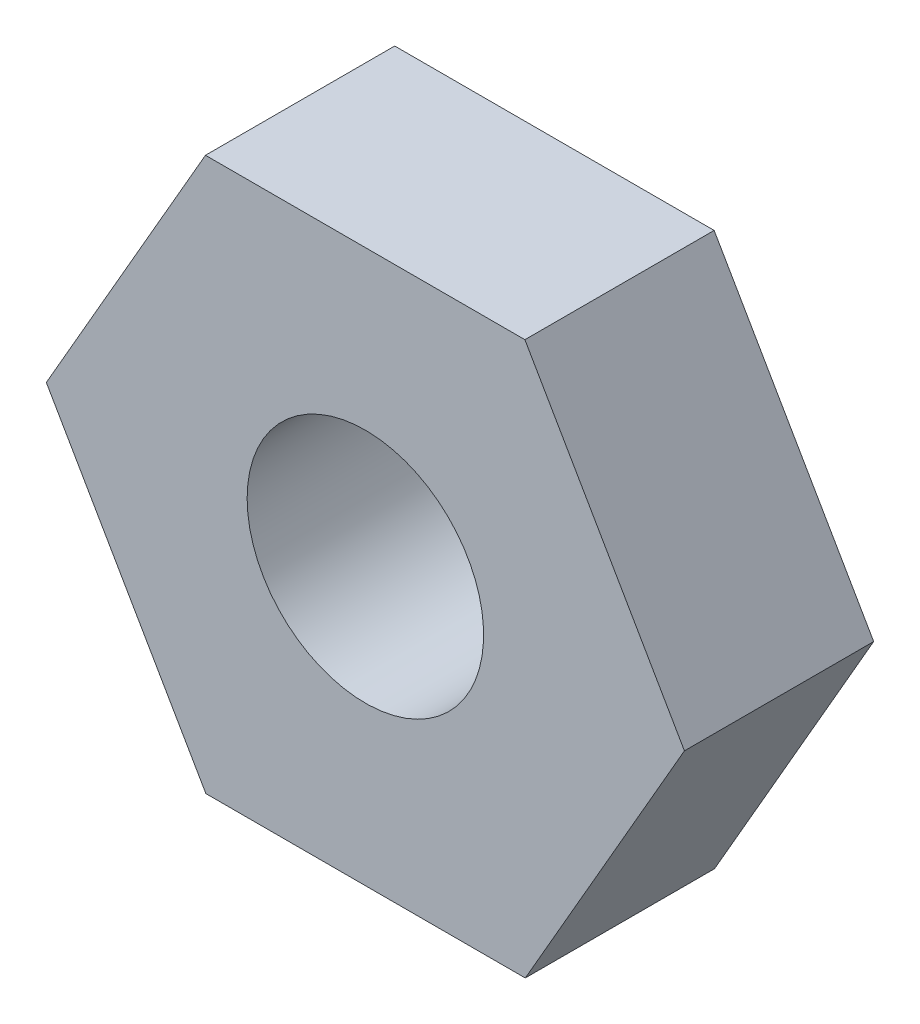
ISO-10303-21;
HEADER;
FILE_DESCRIPTION(('STEP AP214'),'2;1');
FILE_NAME('part.step','',(''),(''),'','','');
FILE_SCHEMA(('AUTOMOTIVE_DESIGN { 1 0 10303 214 1 1 1 1 }'));
ENDSEC;
DATA;
#1=APPLICATION_CONTEXT('core data for automotive mechanical design processes');
#2=APPLICATION_PROTOCOL_DEFINITION('international standard','automotive_design',2000,#1);
#3=PRODUCT_CONTEXT('',#1,'mechanical');
#4=PRODUCT('Part','Part','',(#3));
#5=PRODUCT_RELATED_PRODUCT_CATEGORY('part','',(#4));
#6=PRODUCT_DEFINITION_FORMATION('','',#4);
#7=PRODUCT_DEFINITION_CONTEXT('part definition',#1,'design');
#8=PRODUCT_DEFINITION('design','',#6,#7);
#9=PRODUCT_DEFINITION_SHAPE('','',#8);
#10=(LENGTH_UNIT() NAMED_UNIT(*) SI_UNIT(.MILLI.,.METRE.));
#11=(NAMED_UNIT(*) PLANE_ANGLE_UNIT() SI_UNIT($,.RADIAN.));
#12=(NAMED_UNIT(*) SI_UNIT($,.STERADIAN.) SOLID_ANGLE_UNIT());
#13=UNCERTAINTY_MEASURE_WITH_UNIT(LENGTH_MEASURE(1.E-05),#10,'distance_accuracy_value','');
#14=(GEOMETRIC_REPRESENTATION_CONTEXT(3) GLOBAL_UNCERTAINTY_ASSIGNED_CONTEXT((#13)) GLOBAL_UNIT_ASSIGNED_CONTEXT((#10,
#11,#12)) REPRESENTATION_CONTEXT('',''));
#15=CARTESIAN_POINT('',(0.,0.,0.));
#16=DIRECTION('',(0.,0.,1.));
#17=DIRECTION('',(1.,0.,0.));
#18=AXIS2_PLACEMENT_3D('',#15,#16,#17);
#19=CARTESIAN_POINT('',(-2.67630717283164,-4.63550000000025,3.175));
#20=DIRECTION('',(0.,0.,1.));
#21=DIRECTION('',(1.,0.,0.));
#22=AXIS2_PLACEMENT_3D('',#19,#20,#21);
#23=PLANE('',#22);
#24=DIRECTION('',(1.,0.,0.));
#25=VECTOR('',#24,1.);
#26=CARTESIAN_POINT('',(2.67630717283242,4.6355,3.175));
#27=LINE('',#26,#25);
#28=CARTESIAN_POINT('',(2.67630717283242,4.6355,3.175));
#29=VERTEX_POINT('',#28);
#30=CARTESIAN_POINT('',(-2.68255612418209,4.6355,3.175));
#31=VERTEX_POINT('',#30);
#32=EDGE_CURVE('E106',#29,#31,#27,.F.);
#33=ORIENTED_EDGE('',*,*,#32,.T.);
#34=DIRECTION('',(0.499123639839712,0.86653077969173,0.));
#35=VECTOR('',#34,1.);
#36=CARTESIAN_POINT('',(-2.68255612418209,4.6355,3.175));
#37=LINE('',#36,#35);
#38=CARTESIAN_POINT('',(-5.3526143456565,9.03799468677016E-13,3.175));
#39=VERTEX_POINT('',#38);
#40=EDGE_CURVE('E101',#31,#39,#37,.F.);
#41=ORIENTED_EDGE('',*,*,#40,.T.);
#42=DIRECTION('',(-0.499999999999394,0.866025403784788,0.));
#43=VECTOR('',#42,1.);
#44=CARTESIAN_POINT('',(-5.3526143456565,9.04875133156402E-13,3.175));
#45=LINE('',#44,#43);
#46=CARTESIAN_POINT('',(-2.67630717283164,-4.63550000000025,3.175));
#47=VERTEX_POINT('',#46);
#48=EDGE_CURVE('E70',#39,#47,#45,.F.);
#49=ORIENTED_EDGE('',*,*,#48,.T.);
#50=DIRECTION('',(1.,0.,0.));
#51=VECTOR('',#50,1.);
#52=CARTESIAN_POINT('',(-2.67630717283164,-4.63550000000025,3.175));
#53=LINE('',#52,#51);
#54=CARTESIAN_POINT('',(2.68255612418174,-4.63550000000025,3.175));
#55=VERTEX_POINT('',#54);
#56=EDGE_CURVE('E68',#47,#55,#53,.T.);
#57=ORIENTED_EDGE('',*,*,#56,.T.);
#58=DIRECTION('',(-0.499123639839719,-0.866530779691726,0.));
#59=VECTOR('',#58,1.);
#60=CARTESIAN_POINT('',(5.35261434565674,-2.26381413614973E-13,3.175));
#61=LINE('',#60,#59);
#62=CARTESIAN_POINT('',(5.35261434565674,-2.26381413614973E-13,3.175));
#63=VERTEX_POINT('',#62);
#64=EDGE_CURVE('E65',#55,#63,#61,.F.);
#65=ORIENTED_EDGE('',*,*,#64,.T.);
#66=DIRECTION('',(0.499999999999394,-0.866025403784788,0.));
#67=VECTOR('',#66,1.);
#68=CARTESIAN_POINT('',(5.35261434565674,-2.26381413614973E-13,3.175));
#69=LINE('',#68,#67);
#70=EDGE_CURVE('E111',#63,#29,#69,.F.);
#71=ORIENTED_EDGE('',*,*,#70,.T.);
#72=EDGE_LOOP('',(#33,#41,#49,#57,#65,#71));
#73=FACE_BOUND('',#72,.T.);
#74=CARTESIAN_POINT('',(0.,0.,3.175));
#75=DIRECTION('',(0.,0.,-1.));
#76=DIRECTION('',(-1.,0.,0.));
#77=AXIS2_PLACEMENT_3D('',#74,#75,#76);
#78=CIRCLE('',#77,1.98374);
#79=CARTESIAN_POINT('',(-1.98374,0.,3.175));
#80=VERTEX_POINT('',#79);
#81=EDGE_CURVE('E18',#80,#80,#78,.T.);
#82=ORIENTED_EDGE('',*,*,#81,.T.);
#83=EDGE_LOOP('',(#82));
#84=FACE_BOUND('',#83,.T.);
#85=ADVANCED_FACE('F15',(#73,#84),#23,.T.);
#86=CARTESIAN_POINT('',(0.,0.,-11.3382349024372));
#87=DIRECTION('',(0.,0.,-1.));
#88=DIRECTION('',(-1.,0.,0.));
#89=AXIS2_PLACEMENT_3D('',#86,#87,#88);
#90=CYLINDRICAL_SURFACE('',#89,1.98374);
#91=ORIENTED_EDGE('',*,*,#81,.F.);
#92=EDGE_LOOP('',(#91));
#93=FACE_BOUND('',#92,.T.);
#94=CARTESIAN_POINT('',(0.,0.,0.));
#95=DIRECTION('',(0.,0.,-1.));
#96=DIRECTION('',(-1.,0.,0.));
#97=AXIS2_PLACEMENT_3D('',#94,#95,#96);
#98=CIRCLE('',#97,1.98374);
#99=CARTESIAN_POINT('',(-1.98374,0.,0.));
#100=VERTEX_POINT('',#99);
#101=EDGE_CURVE('E89',#100,#100,#98,.T.);
#102=ORIENTED_EDGE('',*,*,#101,.T.);
#103=EDGE_LOOP('',(#102));
#104=FACE_BOUND('',#103,.T.);
#105=ADVANCED_FACE('F152',(#93,#104),#90,.F.);
#106=CARTESIAN_POINT('',(-2.67630717283164,-4.63550000000025,3.175));
#107=DIRECTION('',(0.,1.,0.));
#108=DIRECTION('',(0.,0.,1.));
#109=AXIS2_PLACEMENT_3D('',#106,#107,#108);
#110=PLANE('',#109);
#111=DIRECTION('',(0.,0.,1.));
#112=VECTOR('',#111,1.);
#113=CARTESIAN_POINT('',(2.68255612418174,-4.63550000000025,3.175));
#114=LINE('',#113,#112);
#115=CARTESIAN_POINT('',(2.68255612418174,-4.63550000000025,0.));
#116=VERTEX_POINT('',#115);
#117=EDGE_CURVE('E75',#116,#55,#114,.T.);
#118=ORIENTED_EDGE('',*,*,#117,.T.);
#119=ORIENTED_EDGE('',*,*,#56,.F.);
#120=DIRECTION('',(0.,0.,1.));
#121=VECTOR('',#120,1.);
#122=CARTESIAN_POINT('',(-2.67630717283164,-4.63550000000025,3.175));
#123=LINE('',#122,#121);
#124=CARTESIAN_POINT('',(-2.67630717283164,-4.63550000000025,0.));
#125=VERTEX_POINT('',#124);
#126=EDGE_CURVE('E91',#47,#125,#123,.F.);
#127=ORIENTED_EDGE('',*,*,#126,.T.);
#128=DIRECTION('',(1.,0.,0.));
#129=VECTOR('',#128,1.);
#130=CARTESIAN_POINT('',(-2.67630717283164,-4.63550000000025,0.));
#131=LINE('',#130,#129);
#132=EDGE_CURVE('E86',#125,#116,#131,.T.);
#133=ORIENTED_EDGE('',*,*,#132,.T.);
#134=EDGE_LOOP('',(#118,#119,#127,#133));
#135=FACE_BOUND('',#134,.T.);
#136=ADVANCED_FACE('F85',(#135),#110,.F.);
#137=CARTESIAN_POINT('',(5.35261434565674,-2.26381413614973E-13,3.175));
#138=DIRECTION('',(-0.866530779691726,0.499123639839719,0.));
#139=DIRECTION('',(-0.499123639839719,-0.866530779691726,0.));
#140=AXIS2_PLACEMENT_3D('',#137,#138,#139);
#141=PLANE('',#140);
#142=DIRECTION('',(0.,0.,1.));
#143=VECTOR('',#142,1.);
#144=CARTESIAN_POINT('',(5.35261434565674,-2.26381413614973E-13,3.175));
#145=LINE('',#144,#143);
#146=CARTESIAN_POINT('',(5.35261434565674,-2.26381413614973E-13,0.));
#147=VERTEX_POINT('',#146);
#148=EDGE_CURVE('E82',#147,#63,#145,.T.);
#149=ORIENTED_EDGE('',*,*,#148,.T.);
#150=ORIENTED_EDGE('',*,*,#64,.F.);
#151=ORIENTED_EDGE('',*,*,#117,.F.);
#152=DIRECTION('',(0.49912363983972,0.866530779691725,0.));
#153=VECTOR('',#152,1.);
#154=CARTESIAN_POINT('',(2.68255612418174,-4.63550000000025,0.));
#155=LINE('',#154,#153);
#156=EDGE_CURVE('E94',#116,#147,#155,.T.);
#157=ORIENTED_EDGE('',*,*,#156,.T.);
#158=EDGE_LOOP('',(#149,#150,#151,#157));
#159=FACE_BOUND('',#158,.T.);
#160=ADVANCED_FACE('F79',(#159),#141,.F.);
#161=CARTESIAN_POINT('',(5.35261434565674,-2.26381413614973E-13,3.175));
#162=DIRECTION('',(-0.866025403784788,-0.499999999999394,0.));
#163=DIRECTION('',(0.499999999999394,-0.866025403784788,0.));
#164=AXIS2_PLACEMENT_3D('',#161,#162,#163);
#165=PLANE('',#164);
#166=DIRECTION('',(0.,0.,-1.));
#167=VECTOR('',#166,1.);
#168=CARTESIAN_POINT('',(2.67630717283242,4.6355,3.175));
#169=LINE('',#168,#167);
#170=CARTESIAN_POINT('',(2.67630717283242,4.6355,0.));
#171=VERTEX_POINT('',#170);
#172=EDGE_CURVE('E108',#171,#29,#169,.F.);
#173=ORIENTED_EDGE('',*,*,#172,.T.);
#174=ORIENTED_EDGE('',*,*,#70,.F.);
#175=ORIENTED_EDGE('',*,*,#148,.F.);
#176=DIRECTION('',(-0.499999999999394,0.866025403784788,0.));
#177=VECTOR('',#176,1.);
#178=CARTESIAN_POINT('',(5.35261434565674,-2.26381413614973E-13,0.));
#179=LINE('',#178,#177);
#180=EDGE_CURVE('E122',#147,#171,#179,.T.);
#181=ORIENTED_EDGE('',*,*,#180,.T.);
#182=EDGE_LOOP('',(#173,#174,#175,#181));
#183=FACE_BOUND('',#182,.T.);
#184=ADVANCED_FACE('F120',(#183),#165,.F.);
#185=CARTESIAN_POINT('',(2.67630717283242,4.6355,3.175));
#186=DIRECTION('',(0.,-1.,0.));
#187=DIRECTION('',(0.,0.,-1.));
#188=AXIS2_PLACEMENT_3D('',#185,#186,#187);
#189=PLANE('',#188);
#190=DIRECTION('',(0.,0.,1.));
#191=VECTOR('',#190,1.);
#192=CARTESIAN_POINT('',(-2.68255612418209,4.6355,3.175));
#193=LINE('',#192,#191);
#194=CARTESIAN_POINT('',(-2.68255612418209,4.6355,0.));
#195=VERTEX_POINT('',#194);
#196=EDGE_CURVE('E103',#195,#31,#193,.T.);
#197=ORIENTED_EDGE('',*,*,#196,.T.);
#198=ORIENTED_EDGE('',*,*,#32,.F.);
#199=ORIENTED_EDGE('',*,*,#172,.F.);
#200=DIRECTION('',(1.,0.,0.));
#201=VECTOR('',#200,1.);
#202=CARTESIAN_POINT('',(-2.67630717283164,4.6355,0.));
#203=LINE('',#202,#201);
#204=EDGE_CURVE('E124',#171,#195,#203,.F.);
#205=ORIENTED_EDGE('',*,*,#204,.T.);
#206=EDGE_LOOP('',(#197,#198,#199,#205));
#207=FACE_BOUND('',#206,.T.);
#208=ADVANCED_FACE('F116',(#207),#189,.F.);
#209=CARTESIAN_POINT('',(-2.68255612418209,4.6355,3.175));
#210=DIRECTION('',(0.86653077969173,-0.499123639839712,0.));
#211=DIRECTION('',(0.499123639839712,0.86653077969173,0.));
#212=AXIS2_PLACEMENT_3D('',#209,#210,#211);
#213=PLANE('',#212);
#214=DIRECTION('',(0.,0.,1.));
#215=VECTOR('',#214,1.);
#216=CARTESIAN_POINT('',(-5.3526143456565,9.03889690784694E-13,3.175));
#217=LINE('',#216,#215);
#218=CARTESIAN_POINT('',(-5.3526143456565,9.03989204057201E-13,0.));
#219=VERTEX_POINT('',#218);
#220=EDGE_CURVE('E32',#219,#39,#217,.T.);
#221=ORIENTED_EDGE('',*,*,#220,.T.);
#222=ORIENTED_EDGE('',*,*,#40,.F.);
#223=ORIENTED_EDGE('',*,*,#196,.F.);
#224=DIRECTION('',(-0.499123639839712,-0.86653077969173,0.));
#225=VECTOR('',#224,1.);
#226=CARTESIAN_POINT('',(-2.68255612418209,4.6355,0.));
#227=LINE('',#226,#225);
#228=EDGE_CURVE('E24',#195,#219,#227,.T.);
#229=ORIENTED_EDGE('',*,*,#228,.T.);
#230=EDGE_LOOP('',(#221,#222,#223,#229));
#231=FACE_BOUND('',#230,.T.);
#232=ADVANCED_FACE('F131',(#231),#213,.F.);
#233=CARTESIAN_POINT('',(-5.3526143456565,9.04875133156402E-13,3.175));
#234=DIRECTION('',(0.866025403784788,0.499999999999394,0.));
#235=DIRECTION('',(-0.499999999999394,0.866025403784788,0.));
#236=AXIS2_PLACEMENT_3D('',#233,#234,#235);
#237=PLANE('',#236);
#238=ORIENTED_EDGE('',*,*,#126,.F.);
#239=ORIENTED_EDGE('',*,*,#48,.F.);
#240=ORIENTED_EDGE('',*,*,#220,.F.);
#241=DIRECTION('',(0.499999999999395,-0.866025403784788,0.));
#242=VECTOR('',#241,1.);
#243=CARTESIAN_POINT('',(-5.3526143456565,9.03790930983916E-13,0.));
#244=LINE('',#243,#242);
#245=EDGE_CURVE('E10',#219,#125,#244,.T.);
#246=ORIENTED_EDGE('',*,*,#245,.T.);
#247=EDGE_LOOP('',(#238,#239,#240,#246));
#248=FACE_BOUND('',#247,.T.);
#249=ADVANCED_FACE('F134',(#248),#237,.F.);
#250=CARTESIAN_POINT('',(-2.67630717283164,-4.63550000000025,0.));
#251=DIRECTION('',(0.,0.,1.));
#252=DIRECTION('',(1.,0.,0.));
#253=AXIS2_PLACEMENT_3D('',#250,#251,#252);
#254=PLANE('',#253);
#255=ORIENTED_EDGE('',*,*,#228,.F.);
#256=ORIENTED_EDGE('',*,*,#204,.F.);
#257=ORIENTED_EDGE('',*,*,#180,.F.);
#258=ORIENTED_EDGE('',*,*,#156,.F.);
#259=ORIENTED_EDGE('',*,*,#132,.F.);
#260=ORIENTED_EDGE('',*,*,#245,.F.);
#261=EDGE_LOOP('',(#255,#256,#257,#258,#259,#260));
#262=FACE_BOUND('',#261,.T.);
#263=ORIENTED_EDGE('',*,*,#101,.F.);
#264=EDGE_LOOP('',(#263));
#265=FACE_BOUND('',#264,.T.);
#266=ADVANCED_FACE('F132',(#262,#265),#254,.F.);
#267=CLOSED_SHELL('',(#85,#105,#136,#160,#184,#208,#232,#249,#266));
#268=MANIFOLD_SOLID_BREP('B1',#267);
#269=ADVANCED_BREP_SHAPE_REPRESENTATION('',(#18,#268),#14);
#270=SHAPE_DEFINITION_REPRESENTATION(#9,#269);
ENDSEC;
END-ISO-10303-21;
